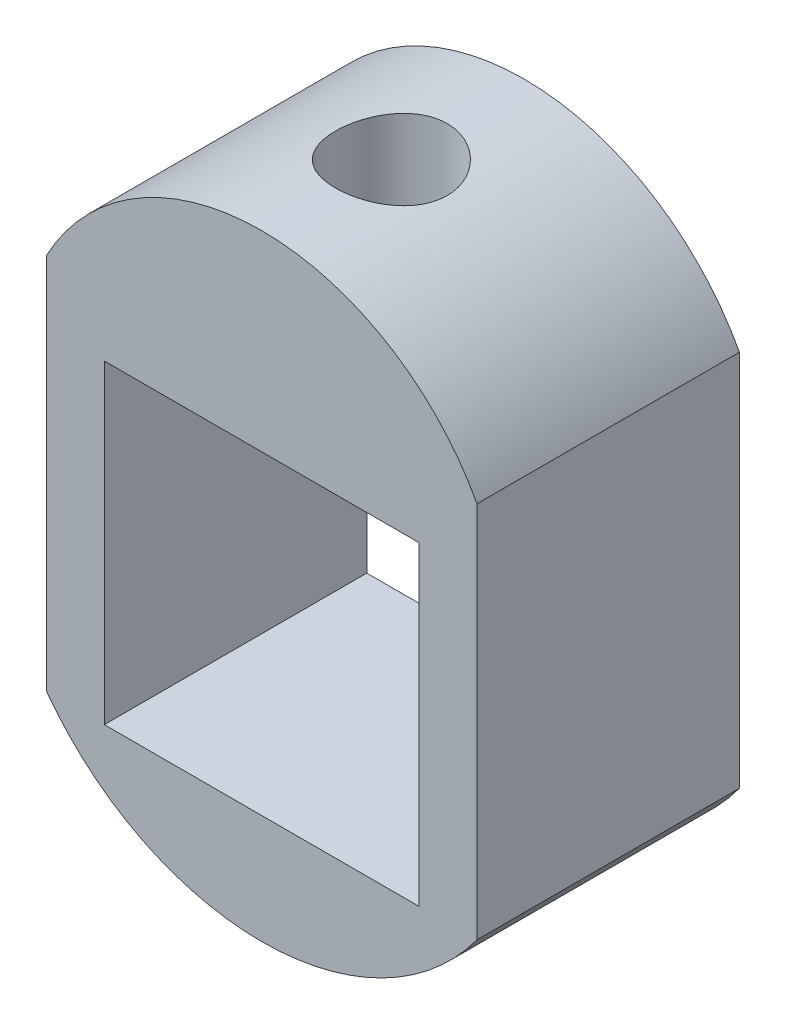
ISO-10303-21;
HEADER;
FILE_DESCRIPTION(('STEP AP214'),'2;1');
FILE_NAME('part.step','',(''),(''),'','','');
FILE_SCHEMA(('AUTOMOTIVE_DESIGN { 1 0 10303 214 1 1 1 1 }'));
ENDSEC;
DATA;
#1=APPLICATION_CONTEXT('core data for automotive mechanical design processes');
#2=APPLICATION_PROTOCOL_DEFINITION('international standard','automotive_design',2000,#1);
#3=PRODUCT_CONTEXT('',#1,'mechanical');
#4=PRODUCT('Part','Part','',(#3));
#5=PRODUCT_RELATED_PRODUCT_CATEGORY('part','',(#4));
#6=PRODUCT_DEFINITION_FORMATION('','',#4);
#7=PRODUCT_DEFINITION_CONTEXT('part definition',#1,'design');
#8=PRODUCT_DEFINITION('design','',#6,#7);
#9=PRODUCT_DEFINITION_SHAPE('','',#8);
#10=(LENGTH_UNIT() NAMED_UNIT(*) SI_UNIT(.MILLI.,.METRE.));
#11=(NAMED_UNIT(*) PLANE_ANGLE_UNIT() SI_UNIT($,.RADIAN.));
#12=(NAMED_UNIT(*) SI_UNIT($,.STERADIAN.) SOLID_ANGLE_UNIT());
#13=UNCERTAINTY_MEASURE_WITH_UNIT(LENGTH_MEASURE(1.E-05),#10,'distance_accuracy_value','');
#14=(GEOMETRIC_REPRESENTATION_CONTEXT(3) GLOBAL_UNCERTAINTY_ASSIGNED_CONTEXT((#13)) GLOBAL_UNIT_ASSIGNED_CONTEXT((#10,
#11,#12)) REPRESENTATION_CONTEXT('',''));
#15=CARTESIAN_POINT('',(0.,0.,0.));
#16=DIRECTION('',(0.,0.,1.));
#17=DIRECTION('',(1.,0.,0.));
#18=AXIS2_PLACEMENT_3D('',#15,#16,#17);
#19=CARTESIAN_POINT('',(-5.207,0.,6.35));
#20=DIRECTION('',(1.,0.,0.));
#21=DIRECTION('',(0.,0.,-1.));
#22=AXIS2_PLACEMENT_3D('',#19,#20,#21);
#23=PLANE('',#22);
#24=DIRECTION('',(0.,-1.,0.));
#25=VECTOR('',#24,1.);
#26=CARTESIAN_POINT('',(-5.207,0.,0.));
#27=LINE('',#26,#25);
#28=CARTESIAN_POINT('',(-5.207,2.78605119299707,0.));
#29=VERTEX_POINT('',#28);
#30=CARTESIAN_POINT('',(-5.207,-6.35,0.));
#31=VERTEX_POINT('',#30);
#32=EDGE_CURVE('E149',#29,#31,#27,.T.);
#33=ORIENTED_EDGE('',*,*,#32,.T.);
#34=DIRECTION('',(0.,0.,-1.));
#35=VECTOR('',#34,1.);
#36=CARTESIAN_POINT('',(-5.207,-6.35,6.35));
#37=LINE('',#36,#35);
#38=CARTESIAN_POINT('',(-5.207,-6.35,6.35));
#39=VERTEX_POINT('',#38);
#40=EDGE_CURVE('E128',#39,#31,#37,.T.);
#41=ORIENTED_EDGE('',*,*,#40,.F.);
#42=DIRECTION('',(0.,-1.,0.));
#43=VECTOR('',#42,1.);
#44=CARTESIAN_POINT('',(-5.207,0.,6.35));
#45=LINE('',#44,#43);
#46=CARTESIAN_POINT('',(-5.207,2.78605119299707,6.35));
#47=VERTEX_POINT('',#46);
#48=EDGE_CURVE('E117',#47,#39,#45,.T.);
#49=ORIENTED_EDGE('',*,*,#48,.F.);
#50=DIRECTION('',(0.,0.,-1.));
#51=VECTOR('',#50,1.);
#52=CARTESIAN_POINT('',(-5.207,2.78605119299707,6.35));
#53=LINE('',#52,#51);
#54=EDGE_CURVE('E56',#47,#29,#53,.T.);
#55=ORIENTED_EDGE('',*,*,#54,.T.);
#56=EDGE_LOOP('',(#33,#41,#49,#55));
#57=FACE_BOUND('',#56,.T.);
#58=ADVANCED_FACE('F35',(#57),#23,.F.);
#59=CARTESIAN_POINT('',(0.,-2.54,6.35));
#60=DIRECTION('',(0.,0.,-1.));
#61=DIRECTION('',(-1.,0.,0.));
#62=AXIS2_PLACEMENT_3D('',#59,#60,#61);
#63=CYLINDRICAL_SURFACE('',#62,6.45204998430731);
#64=CARTESIAN_POINT('',(1.35255,-8.84868904745669,3.175));
#65=CARTESIAN_POINT('',(1.35254731810095,-8.84869055847578,3.09992777123366));
#66=CARTESIAN_POINT('',(1.34627851866973,-8.85004364838439,3.02482255480596));
#67=CARTESIAN_POINT('',(1.32139313500362,-8.85530085935125,2.8767424233238));
#68=CARTESIAN_POINT('',(1.30276715161953,-8.85920692222398,2.80376917403624));
#69=CARTESIAN_POINT('',(1.25377504631357,-8.86910869684373,2.66211657545291));
#70=CARTESIAN_POINT('',(1.22342120677507,-8.87510222178223,2.59343282097094));
#71=CARTESIAN_POINT('',(1.15186944164405,-8.88850098616977,2.46213280625693));
#72=CARTESIAN_POINT('',(1.1106719278967,-8.89590617200065,2.39951631571237));
#73=CARTESIAN_POINT('',(1.01792048096284,-8.91142232275063,2.28115404702036));
#74=CARTESIAN_POINT('',(0.966230221653893,-8.91954168523675,2.22551618010988));
#75=CARTESIAN_POINT('',(0.854255004738417,-8.93549763141253,2.12363411274931));
#76=CARTESIAN_POINT('',(0.793969412797882,-8.94333419417808,2.07739060621264));
#77=CARTESIAN_POINT('',(0.66579569806459,-8.95793259488021,1.99518709225247));
#78=CARTESIAN_POINT('',(0.597840034780791,-8.9646833719222,1.95933026259963));
#79=CARTESIAN_POINT('',(0.456702939130856,-8.97625497327133,1.89958460707973));
#80=CARTESIAN_POINT('',(0.383522045599843,-8.98107599624044,1.87569454920836));
#81=CARTESIAN_POINT('',(0.235132843141455,-8.98818555581861,1.84089827239146));
#82=CARTESIAN_POINT('',(0.159969046284714,-8.99050964297623,1.82980961656334));
#83=CARTESIAN_POINT('',(0.00881449120110587,-8.99248644778009,1.82036110592088));
#84=CARTESIAN_POINT('',(-0.0671761789763218,-8.99213944712988,1.82199990881826));
#85=CARTESIAN_POINT('',(-0.216571729266554,-8.98884053094804,1.83782268118119));
#86=CARTESIAN_POINT('',(-0.289998462602698,-8.98592943508368,1.85181007265897));
#87=CARTESIAN_POINT('',(-0.433438831473196,-8.97787568927622,1.89162044013924));
#88=CARTESIAN_POINT('',(-0.503452321077305,-8.97273294401381,1.91744392169329));
#89=CARTESIAN_POINT('',(-0.638631957713402,-8.96072728187202,1.98037138395562));
#90=CARTESIAN_POINT('',(-0.703761778992071,-8.9538528696715,2.01755111610843));
#91=CARTESIAN_POINT('',(-0.826930238483115,-8.93913967502419,2.10207941718561));
#92=CARTESIAN_POINT('',(-0.884967983241743,-8.93130077132072,2.14942926526468));
#93=CARTESIAN_POINT('',(-0.993472738957296,-8.91534552825491,2.2540280367513));
#94=CARTESIAN_POINT('',(-1.0437736680983,-8.9072267502823,2.31144901333151));
#95=CARTESIAN_POINT('',(-1.1340611255008,-8.89176816342655,2.43399446794144));
#96=CARTESIAN_POINT('',(-1.1740474181972,-8.88442837233611,2.49911912185777));
#97=CARTESIAN_POINT('',(-1.24263607596657,-8.87135313917361,2.63547685852368));
#98=CARTESIAN_POINT('',(-1.27120929603508,-8.86562181551361,2.70672502248883));
#99=CARTESIAN_POINT('',(-1.31592882493586,-8.85647106327837,2.85315957228081));
#100=CARTESIAN_POINT('',(-1.3320769288861,-8.85305130074916,2.92834538753864));
#101=CARTESIAN_POINT('',(-1.35123490663019,-8.84897839292712,3.0790095276323));
#102=CARTESIAN_POINT('',(-1.35448561844921,-8.84827453934305,3.15445589235884));
#103=CARTESIAN_POINT('',(-1.34840661006562,-8.84957668900457,3.30481263520358));
#104=CARTESIAN_POINT('',(-1.33907767863095,-8.85158252234757,3.37972304663101));
#105=CARTESIAN_POINT('',(-1.30831250563892,-8.85803035107541,3.52605734283153));
#106=CARTESIAN_POINT('',(-1.28700693930963,-8.86244603800571,3.59750996596524));
#107=CARTESIAN_POINT('',(-1.23303389306623,-8.87319263451254,3.73583138544158));
#108=CARTESIAN_POINT('',(-1.20036539971863,-8.87952371491208,3.80269977228964));
#109=CARTESIAN_POINT('',(-1.12405602217766,-8.89350040050933,3.93100257282938));
#110=CARTESIAN_POINT('',(-1.08026561665732,-8.90116342932189,3.99234612118933));
#111=CARTESIAN_POINT('',(-0.983152919504988,-8.91689372023371,4.10690227594989));
#112=CARTESIAN_POINT('',(-0.929829545127975,-8.9249610281756,4.16011395746654));
#113=CARTESIAN_POINT('',(-0.814079008077935,-8.94075677338239,4.25781992931733));
#114=CARTESIAN_POINT('',(-0.751512523144307,-8.94847712105828,4.30215069157071));
#115=CARTESIAN_POINT('',(-0.619680408628287,-8.96256437782241,4.37967176177823));
#116=CARTESIAN_POINT('',(-0.55041507742037,-8.96893134715135,4.41286256562507));
#117=CARTESIAN_POINT('',(-0.407563671502095,-8.97956013267633,4.46692852360654));
#118=CARTESIAN_POINT('',(-0.334006653201187,-8.98383460145611,4.48787785053961));
#119=CARTESIAN_POINT('',(-0.184318383872938,-8.98985126247602,4.51709958183169));
#120=CARTESIAN_POINT('',(-0.108187476437772,-8.99159379135338,4.52537367145059));
#121=CARTESIAN_POINT('',(0.0429304126044655,-8.99234125050426,4.52893947867642));
#122=CARTESIAN_POINT('',(0.117911464345312,-8.99139784159502,4.52447618083733));
#123=CARTESIAN_POINT('',(0.266029556817464,-8.98698908439122,4.50323838615346));
#124=CARTESIAN_POINT('',(0.339166625574064,-8.98352377444905,4.48646407653119));
#125=CARTESIAN_POINT('',(0.481349391099032,-8.97446323743781,4.44119368048163));
#126=CARTESIAN_POINT('',(0.550405712396408,-8.96887385096616,4.41272972005578));
#127=CARTESIAN_POINT('',(0.68279618502563,-8.95616445503848,4.34492039788759));
#128=CARTESIAN_POINT('',(0.74612983030058,-8.9490443104051,4.30557407506363));
#129=CARTESIAN_POINT('',(0.866480363989624,-8.93389619757885,4.21630439187043));
#130=CARTESIAN_POINT('',(0.923366629582927,-8.92585447033046,4.16620724680415));
#131=CARTESIAN_POINT('',(1.02800902767336,-8.90984735464455,4.05721183459551));
#132=CARTESIAN_POINT('',(1.07576297735877,-8.90188198488912,3.99831146928066));
#133=CARTESIAN_POINT('',(1.16133630717202,-8.88682303151899,3.87252831454006));
#134=CARTESIAN_POINT('',(1.19902895147969,-8.87974111818079,3.80555783595069));
#135=CARTESIAN_POINT('',(1.26256535542218,-8.86739547592961,3.66610142285165));
#136=CARTESIAN_POINT('',(1.28841950332347,-8.86213015396412,3.59362038923312));
#137=CARTESIAN_POINT('',(1.32273073252715,-8.85502608194099,3.46334951486344));
#138=CARTESIAN_POINT('',(1.33389223608762,-8.85266494143895,3.40628503353234));
#139=CARTESIAN_POINT('',(1.34880275454635,-8.84949587164974,3.29115359018727));
#140=CARTESIAN_POINT('',(1.35255207510269,-8.84868787831508,3.23308666961075));
#141=CARTESIAN_POINT('',(1.35255,-8.84868904745669,3.175));
#142=B_SPLINE_CURVE_WITH_KNOTS('',3,(#64,#65,#66,#67,#68,#69,#70,#71,#72,#73,#74,#75,#76,#77,
#78,#79,#80,#81,#82,#83,#84,#85,#86,#87,#88,#89,#90,#91,#92,#93,#94,#95,#96,#97,#98,#99,#100,
#101,#102,#103,#104,#105,#106,#107,#108,#109,#110,#111,#112,#113,#114,#115,#116,#117,#118,#119,
#120,#121,#122,#123,#124,#125,#126,#127,#128,#129,#130,#131,#132,#133,#134,#135,#136,#137,#138,
#139,#140,#141),.UNSPECIFIED.,.T.,.F.,(4,2,2,2,2,2,2,2,2,2,2,2,2,2,2,2,2,2,2,2,2,2,2,2,2,2,2,2,
2,2,2,2,2,2,2,2,2,2,4),(0.,0.225003904809477,0.450179149112278,0.675119207658287,
0.900050724162645,1.12811688913009,1.35619989406017,1.58647646410806,1.81672932182344,
2.04365860838045,2.27056396239987,2.49392104419405,2.71728766706486,2.94217804994337,
3.16709673517585,3.39631844484094,3.62554538899492,3.8553540127441,4.08512942866738,
4.31059337859664,4.53604319215773,4.75907961299433,4.98213593104263,5.20836632590844,
5.43462243213843,5.66472390891371,5.89481514141521,6.123497362313,6.35214917569866,
6.5764330224374,6.80071345839927,7.02438159864208,7.24806949856658,7.47568984661094,
7.70336453279495,7.93378455274242,8.16400199008376,8.33810454022439,8.51219991070387),.UNSPECIFIED.);
#143=CARTESIAN_POINT('',(1.35255,-8.84868904745669,3.175));
#144=VERTEX_POINT('',#143);
#145=EDGE_CURVE('E11',#144,#144,#142,.T.);
#146=ORIENTED_EDGE('',*,*,#145,.T.);
#147=EDGE_LOOP('',(#146));
#148=FACE_BOUND('',#147,.T.);
#149=CARTESIAN_POINT('',(0.,-2.54,0.));
#150=DIRECTION('',(0.,0.,1.));
#151=DIRECTION('',(1.,0.,0.));
#152=AXIS2_PLACEMENT_3D('',#149,#150,#151);
#153=CIRCLE('',#152,6.45204998430731);
#154=CARTESIAN_POINT('',(5.207,-6.35,0.));
#155=VERTEX_POINT('',#154);
#156=EDGE_CURVE('E125',#31,#155,#153,.T.);
#157=ORIENTED_EDGE('',*,*,#156,.T.);
#158=DIRECTION('',(0.,0.,-1.));
#159=VECTOR('',#158,1.);
#160=CARTESIAN_POINT('',(5.207,-6.35,6.35));
#161=LINE('',#160,#159);
#162=CARTESIAN_POINT('',(5.207,-6.35,6.35));
#163=VERTEX_POINT('',#162);
#164=EDGE_CURVE('E123',#163,#155,#161,.T.);
#165=ORIENTED_EDGE('',*,*,#164,.F.);
#166=CARTESIAN_POINT('',(0.,-2.54,6.35));
#167=DIRECTION('',(0.,0.,1.));
#168=DIRECTION('',(1.,0.,0.));
#169=AXIS2_PLACEMENT_3D('',#166,#167,#168);
#170=CIRCLE('',#169,6.45204998430731);
#171=EDGE_CURVE('E111',#39,#163,#170,.T.);
#172=ORIENTED_EDGE('',*,*,#171,.F.);
#173=ORIENTED_EDGE('',*,*,#40,.T.);
#174=EDGE_LOOP('',(#157,#165,#172,#173));
#175=FACE_BOUND('',#174,.T.);
#176=ADVANCED_FACE('F124',(#148,#175),#63,.T.);
#177=CARTESIAN_POINT('',(5.207,0.,6.35));
#178=DIRECTION('',(1.,0.,0.));
#179=DIRECTION('',(0.,0.,-1.));
#180=AXIS2_PLACEMENT_3D('',#177,#178,#179);
#181=PLANE('',#180);
#182=DIRECTION('',(0.,-1.,0.));
#183=VECTOR('',#182,1.);
#184=CARTESIAN_POINT('',(5.207,0.,0.));
#185=LINE('',#184,#183);
#186=CARTESIAN_POINT('',(5.207,2.78605119299707,0.));
#187=VERTEX_POINT('',#186);
#188=EDGE_CURVE('E152',#187,#155,#185,.T.);
#189=ORIENTED_EDGE('',*,*,#188,.F.);
#190=DIRECTION('',(0.,0.,-1.));
#191=VECTOR('',#190,1.);
#192=CARTESIAN_POINT('',(5.207,2.78605119299707,6.35));
#193=LINE('',#192,#191);
#194=CARTESIAN_POINT('',(5.207,2.78605119299707,6.35));
#195=VERTEX_POINT('',#194);
#196=EDGE_CURVE('E82',#195,#187,#193,.T.);
#197=ORIENTED_EDGE('',*,*,#196,.F.);
#198=DIRECTION('',(0.,-1.,0.));
#199=VECTOR('',#198,1.);
#200=CARTESIAN_POINT('',(5.207,0.,6.35));
#201=LINE('',#200,#199);
#202=EDGE_CURVE('E116',#195,#163,#201,.T.);
#203=ORIENTED_EDGE('',*,*,#202,.T.);
#204=ORIENTED_EDGE('',*,*,#164,.T.);
#205=EDGE_LOOP('',(#189,#197,#203,#204));
#206=FACE_BOUND('',#205,.T.);
#207=ADVANCED_FACE('F130',(#206),#181,.T.);
#208=CARTESIAN_POINT('',(3.81,0.,6.35));
#209=DIRECTION('',(-1.,0.,0.));
#210=DIRECTION('',(0.,-1.,0.));
#211=AXIS2_PLACEMENT_3D('',#208,#209,#210);
#212=PLANE('',#211);
#213=DIRECTION('',(0.,1.,0.));
#214=VECTOR('',#213,1.);
#215=CARTESIAN_POINT('',(3.81,0.,0.));
#216=LINE('',#215,#214);
#217=CARTESIAN_POINT('',(3.81,-6.35,0.));
#218=VERTEX_POINT('',#217);
#219=CARTESIAN_POINT('',(3.81,1.27,0.));
#220=VERTEX_POINT('',#219);
#221=EDGE_CURVE('E137',#218,#220,#216,.T.);
#222=ORIENTED_EDGE('',*,*,#221,.F.);
#223=DIRECTION('',(0.,0.,-1.));
#224=VECTOR('',#223,1.);
#225=CARTESIAN_POINT('',(3.81,-6.35,6.35));
#226=LINE('',#225,#224);
#227=CARTESIAN_POINT('',(3.81,-6.35,6.35));
#228=VERTEX_POINT('',#227);
#229=EDGE_CURVE('E94',#228,#218,#226,.T.);
#230=ORIENTED_EDGE('',*,*,#229,.F.);
#231=DIRECTION('',(0.,1.,0.));
#232=VECTOR('',#231,1.);
#233=CARTESIAN_POINT('',(3.81,0.,6.35));
#234=LINE('',#233,#232);
#235=CARTESIAN_POINT('',(3.81,1.27,6.35));
#236=VERTEX_POINT('',#235);
#237=EDGE_CURVE('E157',#228,#236,#234,.T.);
#238=ORIENTED_EDGE('',*,*,#237,.T.);
#239=DIRECTION('',(0.,0.,-1.));
#240=VECTOR('',#239,1.);
#241=CARTESIAN_POINT('',(3.81,1.27,6.35));
#242=LINE('',#241,#240);
#243=EDGE_CURVE('E133',#236,#220,#242,.T.);
#244=ORIENTED_EDGE('',*,*,#243,.T.);
#245=EDGE_LOOP('',(#222,#230,#238,#244));
#246=FACE_BOUND('',#245,.T.);
#247=ADVANCED_FACE('F37',(#246),#212,.T.);
#248=CARTESIAN_POINT('',(0.,-6.35,6.35));
#249=DIRECTION('',(0.,1.,0.));
#250=DIRECTION('',(-1.,0.,0.));
#251=AXIS2_PLACEMENT_3D('',#248,#249,#250);
#252=PLANE('',#251);
#253=DIRECTION('',(1.,0.,0.));
#254=VECTOR('',#253,1.);
#255=CARTESIAN_POINT('',(0.,-6.35,0.));
#256=LINE('',#255,#254);
#257=CARTESIAN_POINT('',(-3.81,-6.35,0.));
#258=VERTEX_POINT('',#257);
#259=EDGE_CURVE('E140',#258,#218,#256,.T.);
#260=ORIENTED_EDGE('',*,*,#259,.F.);
#261=DIRECTION('',(0.,0.,-1.));
#262=VECTOR('',#261,1.);
#263=CARTESIAN_POINT('',(-3.81,-6.35,6.35));
#264=LINE('',#263,#262);
#265=CARTESIAN_POINT('',(-3.81,-6.35,6.35));
#266=VERTEX_POINT('',#265);
#267=EDGE_CURVE('E165',#266,#258,#264,.T.);
#268=ORIENTED_EDGE('',*,*,#267,.F.);
#269=DIRECTION('',(1.,0.,0.));
#270=VECTOR('',#269,1.);
#271=CARTESIAN_POINT('',(0.,-6.35,6.35));
#272=LINE('',#271,#270);
#273=EDGE_CURVE('E224',#266,#228,#272,.T.);
#274=ORIENTED_EDGE('',*,*,#273,.T.);
#275=ORIENTED_EDGE('',*,*,#229,.T.);
#276=EDGE_LOOP('',(#260,#268,#274,#275));
#277=FACE_BOUND('',#276,.T.);
#278=ADVANCED_FACE('F206',(#277),#252,.T.);
#279=CARTESIAN_POINT('',(-3.81,0.,6.35));
#280=DIRECTION('',(-1.,0.,0.));
#281=DIRECTION('',(0.,-1.,0.));
#282=AXIS2_PLACEMENT_3D('',#279,#280,#281);
#283=PLANE('',#282);
#284=DIRECTION('',(0.,1.,0.));
#285=VECTOR('',#284,1.);
#286=CARTESIAN_POINT('',(-3.81,0.,0.));
#287=LINE('',#286,#285);
#288=CARTESIAN_POINT('',(-3.81,1.27,0.));
#289=VERTEX_POINT('',#288);
#290=EDGE_CURVE('E144',#258,#289,#287,.T.);
#291=ORIENTED_EDGE('',*,*,#290,.T.);
#292=DIRECTION('',(0.,0.,-1.));
#293=VECTOR('',#292,1.);
#294=CARTESIAN_POINT('',(-3.81,1.27,6.35));
#295=LINE('',#294,#293);
#296=CARTESIAN_POINT('',(-3.81,1.27,6.35));
#297=VERTEX_POINT('',#296);
#298=EDGE_CURVE('E162',#297,#289,#295,.T.);
#299=ORIENTED_EDGE('',*,*,#298,.F.);
#300=DIRECTION('',(0.,1.,0.));
#301=VECTOR('',#300,1.);
#302=CARTESIAN_POINT('',(-3.81,0.,6.35));
#303=LINE('',#302,#301);
#304=EDGE_CURVE('E222',#266,#297,#303,.T.);
#305=ORIENTED_EDGE('',*,*,#304,.F.);
#306=ORIENTED_EDGE('',*,*,#267,.T.);
#307=EDGE_LOOP('',(#291,#299,#305,#306));
#308=FACE_BOUND('',#307,.T.);
#309=ADVANCED_FACE('F203',(#308),#283,.F.);
#310=CARTESIAN_POINT('',(0.,1.27,6.35));
#311=DIRECTION('',(0.,1.,0.));
#312=DIRECTION('',(-1.,0.,0.));
#313=AXIS2_PLACEMENT_3D('',#310,#311,#312);
#314=PLANE('',#313);
#315=DIRECTION('',(1.,0.,0.));
#316=VECTOR('',#315,1.);
#317=CARTESIAN_POINT('',(0.,1.27,0.));
#318=LINE('',#317,#316);
#319=EDGE_CURVE('E146',#289,#220,#318,.T.);
#320=ORIENTED_EDGE('',*,*,#319,.T.);
#321=ORIENTED_EDGE('',*,*,#243,.F.);
#322=DIRECTION('',(1.,0.,0.));
#323=VECTOR('',#322,1.);
#324=CARTESIAN_POINT('',(0.,1.27,6.35));
#325=LINE('',#324,#323);
#326=EDGE_CURVE('E221',#297,#236,#325,.T.);
#327=ORIENTED_EDGE('',*,*,#326,.F.);
#328=ORIENTED_EDGE('',*,*,#298,.T.);
#329=EDGE_LOOP('',(#320,#321,#327,#328));
#330=FACE_BOUND('',#329,.T.);
#331=ADVANCED_FACE('F200',(#330),#314,.F.);
#332=CARTESIAN_POINT('',(0.,0.,6.35));
#333=DIRECTION('',(0.,0.,-1.));
#334=DIRECTION('',(-1.,0.,0.));
#335=AXIS2_PLACEMENT_3D('',#332,#333,#334);
#336=CYLINDRICAL_SURFACE('',#335,5.90550000000003);
#337=CARTESIAN_POINT('',(-1.35255,5.7485249192728,3.21434654674846));
#338=CARTESIAN_POINT('',(-1.35254755253758,5.74852642502517,3.2892429151539));
#339=CARTESIAN_POINT('',(-1.3463078397767,5.75000459050904,3.36416792548015));
#340=CARTESIAN_POINT('',(-1.32154506049321,5.75574535873707,3.51188064325613));
#341=CARTESIAN_POINT('',(-1.30301366473321,5.76000984955508,3.58466686644456));
#342=CARTESIAN_POINT('',(-1.25428706518104,5.77081553233588,3.72594402095015));
#343=CARTESIAN_POINT('',(-1.22410536736108,5.77735408715409,3.79443981959848));
#344=CARTESIAN_POINT('',(-1.15297441539319,5.79196796330515,3.92539916667142));
#345=CARTESIAN_POINT('',(-1.11202516507732,5.80004328409108,3.98786271724283));
#346=CARTESIAN_POINT('',(-1.01971335521515,5.81698784635845,4.10614068045814));
#347=CARTESIAN_POINT('',(-0.968188857861686,5.82586806263614,4.16182715713219));
#348=CARTESIAN_POINT('',(-0.856538499333979,5.84332604290488,4.26384767939593));
#349=CARTESIAN_POINT('',(-0.796411929415556,5.85190378190148,4.31018095359499));
#350=CARTESIAN_POINT('',(-0.66840045995198,5.86791046847881,4.39269142293514));
#351=CARTESIAN_POINT('',(-0.600433742356766,5.87532495448108,4.4287447281377));
#352=CARTESIAN_POINT('',(-0.459207606952314,5.88804536247796,4.48886905941756));
#353=CARTESIAN_POINT('',(-0.385948842787869,5.89335154435436,4.51294156241039));
#354=CARTESIAN_POINT('',(-0.237549612543536,5.90117991696792,4.5480162255732));
#355=CARTESIAN_POINT('',(-0.162462855472565,5.90374822778011,4.55923515736171));
#356=CARTESIAN_POINT('',(-0.0114320187253266,5.90597156455726,4.56896281353298));
#357=CARTESIAN_POINT('',(0.0645119526313096,5.90562695457978,4.56747312624188));
#358=CARTESIAN_POINT('',(0.213604238843734,5.90209823701594,4.55198553276876));
#359=CARTESIAN_POINT('',(0.28677827780131,5.89896719584083,4.53822137860638));
#360=CARTESIAN_POINT('',(0.429749373412345,5.89027829002513,4.49894907441225));
#361=CARTESIAN_POINT('',(0.499546267901052,5.88472030897519,4.47344036104392));
#362=CARTESIAN_POINT('',(0.634420214832536,5.87171798555809,4.4112019130082));
#363=CARTESIAN_POINT('',(0.699455717935901,5.86425911667869,4.37438529790964));
#364=CARTESIAN_POINT('',(0.822509686794591,5.84827017078372,4.2906412495527));
#365=CARTESIAN_POINT('',(0.880527109370497,5.83973993490148,4.24371231605852));
#366=CARTESIAN_POINT('',(0.989289688083592,5.8223142543553,4.13980915572344));
#367=CARTESIAN_POINT('',(1.03983901924285,5.81341491694922,4.08263040531336));
#368=CARTESIAN_POINT('',(1.13067029351419,5.7964347946514,3.96051471077108));
#369=CARTESIAN_POINT('',(1.17095190117197,5.78835403650846,3.89557751326629));
#370=CARTESIAN_POINT('',(1.24020313178487,5.77391444616205,3.75945055866513));
#371=CARTESIAN_POINT('',(1.26913258137072,5.76756175318366,3.68823966910145));
#372=CARTESIAN_POINT('',(1.31455305486277,5.75738030944454,3.54178640384722));
#373=CARTESIAN_POINT('',(1.33104626437017,5.75355111520761,3.466544739034));
#374=CARTESIAN_POINT('',(1.35081572196531,5.74894154045024,3.31596356529733));
#375=CARTESIAN_POINT('',(1.35437849340895,5.74809507859592,3.24066365163473));
#376=CARTESIAN_POINT('',(1.34896442569326,5.74936803655771,3.09054574136546));
#377=CARTESIAN_POINT('',(1.33998853842795,5.75148723123087,3.01572770860914));
#378=CARTESIAN_POINT('',(1.31000141016514,5.75839002414701,2.86971569729029));
#379=CARTESIAN_POINT('',(1.28915079387624,5.76313803999333,2.79848689144955));
#380=CARTESIAN_POINT('',(1.2361812993855,5.7747308630903,2.66053418066821));
#381=CARTESIAN_POINT('',(1.20406125857834,5.78157588666861,2.59381074136903));
#382=CARTESIAN_POINT('',(1.12884346939902,5.79673473073584,2.46553101941873));
#383=CARTESIAN_POINT('',(1.08557085572991,5.80507123316293,2.40408000701613));
#384=CARTESIAN_POINT('',(0.989502615561245,5.82221525547694,2.28920647731512));
#385=CARTESIAN_POINT('',(0.936705686457633,5.83102283967584,2.23578506002795));
#386=CARTESIAN_POINT('',(0.821785063816795,5.84833640713794,2.13735977986387));
#387=CARTESIAN_POINT('',(0.759491513467017,5.85683242771775,2.09255218213631));
#388=CARTESIAN_POINT('',(0.628095817423184,5.87237566154498,2.01403682039878));
#389=CARTESIAN_POINT('',(0.558994004878278,5.8794229456315,1.98032851361659));
#390=CARTESIAN_POINT('',(0.416392965977667,5.89123300711111,1.92523427222648));
#391=CARTESIAN_POINT('',(0.342926751212368,5.89601095797001,1.90376629557912));
#392=CARTESIAN_POINT('',(0.193307788881995,5.90280989499429,1.87350858709534));
#393=CARTESIAN_POINT('',(0.117155473743602,5.90483132286413,1.86471682401308));
#394=CARTESIAN_POINT('',(-0.0338171861527842,5.90587477988602,1.86015976118673));
#395=CARTESIAN_POINT('',(-0.10862840168037,5.90496402363632,1.86410255332112));
#396=CARTESIAN_POINT('',(-0.256491751788338,5.90039104403118,1.88424480062248));
#397=CARTESIAN_POINT('',(-0.329543924078109,5.8967288797132,1.90044399280177));
#398=CARTESIAN_POINT('',(-0.471564320974082,5.88707129753994,1.94449375968619));
#399=CARTESIAN_POINT('',(-0.540547169564884,5.88108490599789,1.97229929128772));
#400=CARTESIAN_POINT('',(-0.672905335027142,5.86741516940092,2.03872984097792));
#401=CARTESIAN_POINT('',(-0.736280051729318,5.85973164302942,2.07735601522851));
#402=CARTESIAN_POINT('',(-0.857034736684137,5.84330517297804,2.16526381518571));
#403=CARTESIAN_POINT('',(-0.914264358730588,5.83454366927609,2.21474851038703));
#404=CARTESIAN_POINT('',(-1.01970689012116,5.81704318453911,2.32256381260867));
#405=CARTESIAN_POINT('',(-1.06791759267159,5.80830420953103,2.38089657831236));
#406=CARTESIAN_POINT('',(-1.15465407962349,5.7916913402144,2.50580350040717));
#407=CARTESIAN_POINT('',(-1.19302399729225,5.78383236262008,2.57248800435486));
#408=CARTESIAN_POINT('',(-1.257951033138,5.77006059271307,2.71152722043434));
#409=CARTESIAN_POINT('',(-1.28451771606786,5.76414622559913,2.78387728534375));
#410=CARTESIAN_POINT('',(-1.32058602010433,5.75597438330428,2.91592638815698));
#411=CARTESIAN_POINT('',(-1.33254857215427,5.75320013076113,2.9749335435841));
#412=CARTESIAN_POINT('',(-1.34853131158451,5.74947484767584,3.09406986829308));
#413=CARTESIAN_POINT('',(-1.35255196550157,5.74852371003722,3.15419897145806));
#414=CARTESIAN_POINT('',(-1.35255,5.7485249192728,3.21434654674846));
#415=B_SPLINE_CURVE_WITH_KNOTS('',3,(#337,#338,#339,#340,#341,#342,#343,#344,#345,#346,#347,
#348,#349,#350,#351,#352,#353,#354,#355,#356,#357,#358,#359,#360,#361,#362,#363,#364,#365,#366,
#367,#368,#369,#370,#371,#372,#373,#374,#375,#376,#377,#378,#379,#380,#381,#382,#383,#384,#385,
#386,#387,#388,#389,#390,#391,#392,#393,#394,#395,#396,#397,#398,#399,#400,#401,#402,#403,#404,
#405,#406,#407,#408,#409,#410,#411,#412,#413,#414),.UNSPECIFIED.,.T.,.F.,(4,2,2,2,2,2,2,2,2,2,2,
2,2,2,2,2,2,2,2,2,2,2,2,2,2,2,2,2,2,2,2,2,2,2,2,2,2,2,4),(0.,0.224468535810266,
0.449089334285811,0.673450512449134,0.897811610765025,1.12590604709458,1.3540192874743,
1.58477548931944,1.81550323798766,2.04227974314833,2.26902790614455,2.49154801739183,
2.71407880309508,2.93836401032293,3.16268251482574,3.39211225854032,3.6215494969383,
3.85179150655859,4.08199304296737,4.30706132443099,4.53211252037425,4.75418948149683,
4.97628935983328,5.2021094195249,5.42796038720647,5.65846800256529,5.88896434407627,
6.11789702924744,6.34679302599734,6.57047971054784,6.79416159555111,7.01698334680581,
7.23982891516255,7.46726408435339,7.69475483092197,7.92565273799203,8.15636319410922,
8.33663937610266,8.51690496768495),.UNSPECIFIED.);
#416=CARTESIAN_POINT('',(-1.35255,5.7485249192728,3.21434654674846));
#417=VERTEX_POINT('',#416);
#418=EDGE_CURVE('E48',#417,#417,#415,.T.);
#419=ORIENTED_EDGE('',*,*,#418,.F.);
#420=EDGE_LOOP('',(#419));
#421=FACE_BOUND('',#420,.T.);
#422=CARTESIAN_POINT('',(0.,0.,0.));
#423=DIRECTION('',(0.,0.,1.));
#424=DIRECTION('',(1.,0.,0.));
#425=AXIS2_PLACEMENT_3D('',#422,#423,#424);
#426=CIRCLE('',#425,5.90550000000003);
#427=EDGE_CURVE('E154',#29,#187,#426,.F.);
#428=ORIENTED_EDGE('',*,*,#427,.F.);
#429=ORIENTED_EDGE('',*,*,#54,.F.);
#430=CARTESIAN_POINT('',(0.,0.,6.35));
#431=DIRECTION('',(0.,0.,1.));
#432=DIRECTION('',(1.,0.,0.));
#433=AXIS2_PLACEMENT_3D('',#430,#431,#432);
#434=CIRCLE('',#433,5.90550000000003);
#435=EDGE_CURVE('E131',#47,#195,#434,.F.);
#436=ORIENTED_EDGE('',*,*,#435,.T.);
#437=ORIENTED_EDGE('',*,*,#196,.T.);
#438=EDGE_LOOP('',(#428,#429,#436,#437));
#439=FACE_BOUND('',#438,.T.);
#440=ADVANCED_FACE('F172',(#421,#439),#336,.T.);
#441=CARTESIAN_POINT('',(0.,0.,6.35));
#442=DIRECTION('',(0.,0.,1.));
#443=DIRECTION('',(1.,0.,0.));
#444=AXIS2_PLACEMENT_3D('',#441,#442,#443);
#445=PLANE('',#444);
#446=ORIENTED_EDGE('',*,*,#237,.F.);
#447=ORIENTED_EDGE('',*,*,#273,.F.);
#448=ORIENTED_EDGE('',*,*,#304,.T.);
#449=ORIENTED_EDGE('',*,*,#326,.T.);
#450=EDGE_LOOP('',(#446,#447,#448,#449));
#451=FACE_BOUND('',#450,.T.);
#452=ORIENTED_EDGE('',*,*,#48,.T.);
#453=ORIENTED_EDGE('',*,*,#171,.T.);
#454=ORIENTED_EDGE('',*,*,#202,.F.);
#455=ORIENTED_EDGE('',*,*,#435,.F.);
#456=EDGE_LOOP('',(#452,#453,#454,#455));
#457=FACE_BOUND('',#456,.T.);
#458=ADVANCED_FACE('F113',(#451,#457),#445,.T.);
#459=CARTESIAN_POINT('',(0.,0.,0.));
#460=DIRECTION('',(0.,0.,1.));
#461=DIRECTION('',(1.,0.,0.));
#462=AXIS2_PLACEMENT_3D('',#459,#460,#461);
#463=PLANE('',#462);
#464=ORIENTED_EDGE('',*,*,#221,.T.);
#465=ORIENTED_EDGE('',*,*,#319,.F.);
#466=ORIENTED_EDGE('',*,*,#290,.F.);
#467=ORIENTED_EDGE('',*,*,#259,.T.);
#468=EDGE_LOOP('',(#464,#465,#466,#467));
#469=FACE_BOUND('',#468,.T.);
#470=ORIENTED_EDGE('',*,*,#32,.F.);
#471=ORIENTED_EDGE('',*,*,#427,.T.);
#472=ORIENTED_EDGE('',*,*,#188,.T.);
#473=ORIENTED_EDGE('',*,*,#156,.F.);
#474=EDGE_LOOP('',(#470,#471,#472,#473));
#475=FACE_BOUND('',#474,.T.);
#476=ADVANCED_FACE('F182',(#469,#475),#463,.F.);
#477=CARTESIAN_POINT('',(0.,2.09550000000003,3.21434654674846));
#478=DIRECTION('',(0.,1.,0.));
#479=DIRECTION('',(-1.,0.,0.));
#480=AXIS2_PLACEMENT_3D('',#477,#478,#479);
#481=CYLINDRICAL_SURFACE('',#480,1.35255);
#482=ORIENTED_EDGE('',*,*,#418,.T.);
#483=EDGE_LOOP('',(#482));
#484=FACE_BOUND('',#483,.T.);
#485=CARTESIAN_POINT('',(0.,2.09550000000003,3.21434654674846));
#486=DIRECTION('',(0.,1.,0.));
#487=DIRECTION('',(-1.,0.,0.));
#488=AXIS2_PLACEMENT_3D('',#485,#486,#487);
#489=CIRCLE('',#488,1.35255);
#490=CARTESIAN_POINT('',(-1.35255,2.09550000000003,3.21434654674846));
#491=VERTEX_POINT('',#490);
#492=EDGE_CURVE('E141',#491,#491,#489,.T.);
#493=ORIENTED_EDGE('',*,*,#492,.F.);
#494=EDGE_LOOP('',(#493));
#495=FACE_BOUND('',#494,.T.);
#496=ADVANCED_FACE('F176',(#484,#495),#481,.F.);
#497=CARTESIAN_POINT('',(0.,2.09550000000003,3.21434654674846));
#498=DIRECTION('',(0.,1.,0.));
#499=DIRECTION('',(-1.,0.,0.));
#500=AXIS2_PLACEMENT_3D('',#497,#498,#499);
#501=PLANE('',#500);
#502=ORIENTED_EDGE('',*,*,#492,.T.);
#503=EDGE_LOOP('',(#502));
#504=FACE_BOUND('',#503,.T.);
#505=ADVANCED_FACE('F181',(#504),#501,.T.);
#506=CARTESIAN_POINT('',(0.,-6.45204998430731,3.175));
#507=DIRECTION('',(0.,-1.,0.));
#508=DIRECTION('',(1.,0.,0.));
#509=AXIS2_PLACEMENT_3D('',#506,#507,#508);
#510=CYLINDRICAL_SURFACE('',#509,1.35255);
#511=CARTESIAN_POINT('',(0.,-6.45204998430731,3.175));
#512=DIRECTION('',(0.,-1.,0.));
#513=DIRECTION('',(1.,0.,0.));
#514=AXIS2_PLACEMENT_3D('',#511,#512,#513);
#515=CIRCLE('',#514,1.35255);
#516=CARTESIAN_POINT('',(1.35255,-6.45204998430731,3.175));
#517=VERTEX_POINT('',#516);
#518=EDGE_CURVE('E231',#517,#517,#515,.T.);
#519=ORIENTED_EDGE('',*,*,#518,.F.);
#520=EDGE_LOOP('',(#519));
#521=FACE_BOUND('',#520,.T.);
#522=ORIENTED_EDGE('',*,*,#145,.F.);
#523=EDGE_LOOP('',(#522));
#524=FACE_BOUND('',#523,.T.);
#525=ADVANCED_FACE('F237',(#521,#524),#510,.F.);
#526=CARTESIAN_POINT('',(0.,-6.45204998430731,3.175));
#527=DIRECTION('',(0.,-1.,0.));
#528=DIRECTION('',(1.,0.,0.));
#529=AXIS2_PLACEMENT_3D('',#526,#527,#528);
#530=PLANE('',#529);
#531=ORIENTED_EDGE('',*,*,#518,.T.);
#532=EDGE_LOOP('',(#531));
#533=FACE_BOUND('',#532,.T.);
#534=ADVANCED_FACE('F235',(#533),#530,.T.);
#535=CLOSED_SHELL('',(#58,#176,#207,#247,#278,#309,#331,#440,#458,#476,#496,#505,#525,#534));
#536=MANIFOLD_SOLID_BREP('B2',#535);
#537=ADVANCED_BREP_SHAPE_REPRESENTATION('',(#18,#536),#14);
#538=SHAPE_DEFINITION_REPRESENTATION(#9,#537);
ENDSEC;
END-ISO-10303-21;
